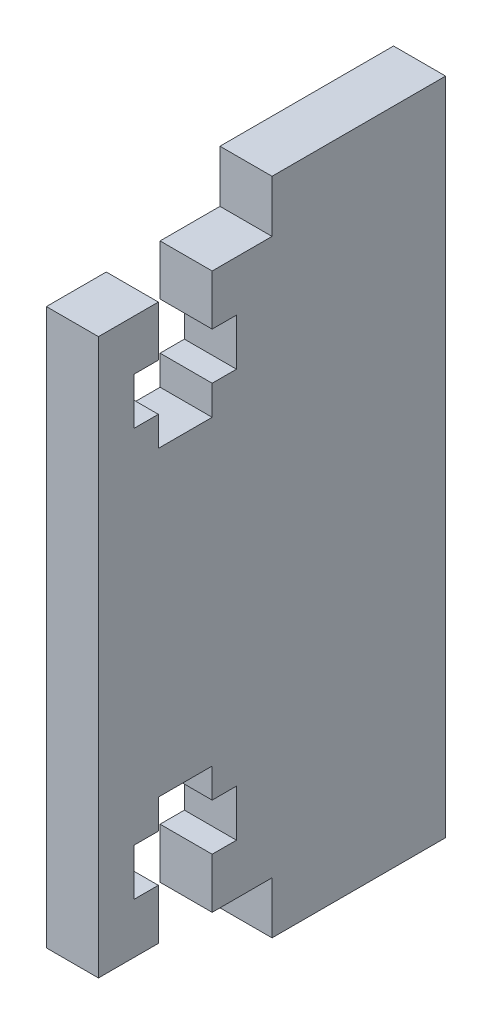
ISO-10303-21;
HEADER;
FILE_DESCRIPTION(('STEP AP214'),'2;1');
FILE_NAME('part.step','',(''),(''),'','','');
FILE_SCHEMA(('AUTOMOTIVE_DESIGN { 1 0 10303 214 1 1 1 1 }'));
ENDSEC;
DATA;
#1=APPLICATION_CONTEXT('core data for automotive mechanical design processes');
#2=APPLICATION_PROTOCOL_DEFINITION('international standard','automotive_design',2000,#1);
#3=PRODUCT_CONTEXT('',#1,'mechanical');
#4=PRODUCT('Part','Part','',(#3));
#5=PRODUCT_RELATED_PRODUCT_CATEGORY('part','',(#4));
#6=PRODUCT_DEFINITION_FORMATION('','',#4);
#7=PRODUCT_DEFINITION_CONTEXT('part definition',#1,'design');
#8=PRODUCT_DEFINITION('design','',#6,#7);
#9=PRODUCT_DEFINITION_SHAPE('','',#8);
#10=(LENGTH_UNIT() NAMED_UNIT(*) SI_UNIT(.MILLI.,.METRE.));
#11=(NAMED_UNIT(*) PLANE_ANGLE_UNIT() SI_UNIT($,.RADIAN.));
#12=(NAMED_UNIT(*) SI_UNIT($,.STERADIAN.) SOLID_ANGLE_UNIT());
#13=UNCERTAINTY_MEASURE_WITH_UNIT(LENGTH_MEASURE(1.E-05),#10,'distance_accuracy_value','');
#14=(GEOMETRIC_REPRESENTATION_CONTEXT(3) GLOBAL_UNCERTAINTY_ASSIGNED_CONTEXT((#13)) GLOBAL_UNIT_ASSIGNED_CONTEXT((#10,
#11,#12)) REPRESENTATION_CONTEXT('',''));
#15=CARTESIAN_POINT('',(0.,0.,0.));
#16=DIRECTION('',(0.,0.,1.));
#17=DIRECTION('',(1.,0.,0.));
#18=AXIS2_PLACEMENT_3D('',#15,#16,#17);
#19=CARTESIAN_POINT('',(0.,3.,0.));
#20=DIRECTION('',(0.,1.,0.));
#21=DIRECTION('',(0.,0.,1.));
#22=AXIS2_PLACEMENT_3D('',#19,#20,#21);
#23=PLANE('',#22);
#24=DIRECTION('',(0.,0.,1.));
#25=VECTOR('',#24,1.);
#26=CARTESIAN_POINT('',(0.,3.,0.));
#27=LINE('',#26,#25);
#28=CARTESIAN_POINT('',(0.,3.,-3.45));
#29=VERTEX_POINT('',#28);
#30=CARTESIAN_POINT('',(0.,3.,0.));
#31=VERTEX_POINT('',#30);
#32=EDGE_CURVE('E453',#29,#31,#27,.T.);
#33=ORIENTED_EDGE('',*,*,#32,.F.);
#34=DIRECTION('',(1.,0.,0.));
#35=VECTOR('',#34,1.);
#36=CARTESIAN_POINT('',(0.,3.,-3.45));
#37=LINE('',#36,#35);
#38=CARTESIAN_POINT('',(3.,3.,-3.45));
#39=VERTEX_POINT('',#38);
#40=EDGE_CURVE('E320',#29,#39,#37,.T.);
#41=ORIENTED_EDGE('',*,*,#40,.T.);
#42=DIRECTION('',(0.,0.,1.));
#43=VECTOR('',#42,1.);
#44=CARTESIAN_POINT('',(3.,3.,0.));
#45=LINE('',#44,#43);
#46=CARTESIAN_POINT('',(3.,3.,0.));
#47=VERTEX_POINT('',#46);
#48=EDGE_CURVE('E459',#39,#47,#45,.T.);
#49=ORIENTED_EDGE('',*,*,#48,.T.);
#50=DIRECTION('',(1.,0.,0.));
#51=VECTOR('',#50,1.);
#52=CARTESIAN_POINT('',(0.,3.,0.));
#53=LINE('',#52,#51);
#54=EDGE_CURVE('E462',#31,#47,#53,.T.);
#55=ORIENTED_EDGE('',*,*,#54,.F.);
#56=EDGE_LOOP('',(#33,#41,#49,#55));
#57=FACE_BOUND('',#56,.T.);
#58=ADVANCED_FACE('F33',(#57),#23,.F.);
#59=CARTESIAN_POINT('',(0.,35.,0.));
#60=DIRECTION('',(0.,-1.,0.));
#61=DIRECTION('',(0.,0.,-1.));
#62=AXIS2_PLACEMENT_3D('',#59,#60,#61);
#63=PLANE('',#62);
#64=DIRECTION('',(0.,0.,-1.));
#65=VECTOR('',#64,1.);
#66=CARTESIAN_POINT('',(0.,35.,0.));
#67=LINE('',#66,#65);
#68=CARTESIAN_POINT('',(0.,35.,-6.55000000000001));
#69=VERTEX_POINT('',#68);
#70=CARTESIAN_POINT('',(0.,35.,-10.));
#71=VERTEX_POINT('',#70);
#72=EDGE_CURVE('E433',#69,#71,#67,.T.);
#73=ORIENTED_EDGE('',*,*,#72,.F.);
#74=DIRECTION('',(1.,0.,0.));
#75=VECTOR('',#74,1.);
#76=CARTESIAN_POINT('',(0.,35.,-6.55000000000001));
#77=LINE('',#76,#75);
#78=CARTESIAN_POINT('',(3.,35.,-6.55000000000001));
#79=VERTEX_POINT('',#78);
#80=EDGE_CURVE('E295',#69,#79,#77,.T.);
#81=ORIENTED_EDGE('',*,*,#80,.T.);
#82=DIRECTION('',(0.,0.,-1.));
#83=VECTOR('',#82,1.);
#84=CARTESIAN_POINT('',(3.,35.,0.));
#85=LINE('',#84,#83);
#86=CARTESIAN_POINT('',(3.,35.,-10.));
#87=VERTEX_POINT('',#86);
#88=EDGE_CURVE('E441',#79,#87,#85,.T.);
#89=ORIENTED_EDGE('',*,*,#88,.T.);
#90=DIRECTION('',(1.,0.,0.));
#91=VECTOR('',#90,1.);
#92=CARTESIAN_POINT('',(0.,35.,-10.));
#93=LINE('',#92,#91);
#94=EDGE_CURVE('E447',#71,#87,#93,.T.);
#95=ORIENTED_EDGE('',*,*,#94,.F.);
#96=EDGE_LOOP('',(#73,#81,#89,#95));
#97=FACE_BOUND('',#96,.T.);
#98=ADVANCED_FACE('F503',(#97),#63,.F.);
#99=CARTESIAN_POINT('',(3.,0.,0.));
#100=DIRECTION('',(0.,0.,-1.));
#101=DIRECTION('',(-1.,0.,0.));
#102=AXIS2_PLACEMENT_3D('',#99,#100,#101);
#103=PLANE('',#102);
#104=DIRECTION('',(0.,-1.,0.));
#105=VECTOR('',#104,1.);
#106=CARTESIAN_POINT('',(3.,0.,0.));
#107=LINE('',#106,#105);
#108=CARTESIAN_POINT('',(3.,35.,0.));
#109=VERTEX_POINT('',#108);
#110=EDGE_CURVE('E468',#109,#47,#107,.T.);
#111=ORIENTED_EDGE('',*,*,#110,.F.);
#112=DIRECTION('',(1.,0.,0.));
#113=VECTOR('',#112,1.);
#114=CARTESIAN_POINT('',(0.,35.,0.));
#115=LINE('',#114,#113);
#116=CARTESIAN_POINT('',(0.,35.,0.));
#117=VERTEX_POINT('',#116);
#118=EDGE_CURVE('E436',#117,#109,#115,.T.);
#119=ORIENTED_EDGE('',*,*,#118,.F.);
#120=DIRECTION('',(0.,-1.,0.));
#121=VECTOR('',#120,1.);
#122=CARTESIAN_POINT('',(0.,0.,0.));
#123=LINE('',#122,#121);
#124=EDGE_CURVE('E446',#117,#31,#123,.T.);
#125=ORIENTED_EDGE('',*,*,#124,.T.);
#126=ORIENTED_EDGE('',*,*,#54,.T.);
#127=EDGE_LOOP('',(#111,#119,#125,#126));
#128=FACE_BOUND('',#127,.T.);
#129=ADVANCED_FACE('F35',(#128),#103,.F.);
#130=CARTESIAN_POINT('',(3.,0.,0.));
#131=DIRECTION('',(0.,1.,0.));
#132=DIRECTION('',(0.,0.,1.));
#133=AXIS2_PLACEMENT_3D('',#130,#131,#132);
#134=PLANE('',#133);
#135=DIRECTION('',(0.,0.,-1.));
#136=VECTOR('',#135,1.);
#137=CARTESIAN_POINT('',(3.,0.,0.));
#138=LINE('',#137,#136);
#139=CARTESIAN_POINT('',(3.,0.,-10.));
#140=VERTEX_POINT('',#139);
#141=CARTESIAN_POINT('',(3.,0.,-20.));
#142=VERTEX_POINT('',#141);
#143=EDGE_CURVE('E471',#140,#142,#138,.T.);
#144=ORIENTED_EDGE('',*,*,#143,.F.);
#145=DIRECTION('',(1.,0.,0.));
#146=VECTOR('',#145,1.);
#147=CARTESIAN_POINT('',(0.,0.,-10.));
#148=LINE('',#147,#146);
#149=CARTESIAN_POINT('',(0.,0.,-10.));
#150=VERTEX_POINT('',#149);
#151=EDGE_CURVE('E456',#150,#140,#148,.T.);
#152=ORIENTED_EDGE('',*,*,#151,.F.);
#153=DIRECTION('',(0.,0.,-1.));
#154=VECTOR('',#153,1.);
#155=CARTESIAN_POINT('',(0.,0.,0.));
#156=LINE('',#155,#154);
#157=CARTESIAN_POINT('',(0.,0.,-20.));
#158=VERTEX_POINT('',#157);
#159=EDGE_CURVE('E481',#150,#158,#156,.T.);
#160=ORIENTED_EDGE('',*,*,#159,.T.);
#161=DIRECTION('',(-1.,0.,0.));
#162=VECTOR('',#161,1.);
#163=CARTESIAN_POINT('',(3.,0.,-20.));
#164=LINE('',#163,#162);
#165=EDGE_CURVE('E11',#142,#158,#164,.T.);
#166=ORIENTED_EDGE('',*,*,#165,.F.);
#167=EDGE_LOOP('',(#144,#152,#160,#166));
#168=FACE_BOUND('',#167,.T.);
#169=ADVANCED_FACE('F515',(#168),#134,.F.);
#170=CARTESIAN_POINT('',(3.,0.,-20.));
#171=DIRECTION('',(0.,0.,1.));
#172=DIRECTION('',(1.,0.,0.));
#173=AXIS2_PLACEMENT_3D('',#170,#171,#172);
#174=PLANE('',#173);
#175=DIRECTION('',(0.,1.,0.));
#176=VECTOR('',#175,1.);
#177=CARTESIAN_POINT('',(0.,0.,-20.));
#178=LINE('',#177,#176);
#179=CARTESIAN_POINT('',(0.,38.,-20.));
#180=VERTEX_POINT('',#179);
#181=EDGE_CURVE('E483',#158,#180,#178,.T.);
#182=ORIENTED_EDGE('',*,*,#181,.T.);
#183=DIRECTION('',(-1.,0.,0.));
#184=VECTOR('',#183,1.);
#185=CARTESIAN_POINT('',(3.,38.,-20.));
#186=LINE('',#185,#184);
#187=CARTESIAN_POINT('',(3.,38.,-20.));
#188=VERTEX_POINT('',#187);
#189=EDGE_CURVE('E41',#188,#180,#186,.T.);
#190=ORIENTED_EDGE('',*,*,#189,.F.);
#191=DIRECTION('',(0.,1.,0.));
#192=VECTOR('',#191,1.);
#193=CARTESIAN_POINT('',(3.,0.,-20.));
#194=LINE('',#193,#192);
#195=EDGE_CURVE('E474',#142,#188,#194,.T.);
#196=ORIENTED_EDGE('',*,*,#195,.F.);
#197=ORIENTED_EDGE('',*,*,#165,.T.);
#198=EDGE_LOOP('',(#182,#190,#196,#197));
#199=FACE_BOUND('',#198,.T.);
#200=ADVANCED_FACE('F513',(#199),#174,.F.);
#201=CARTESIAN_POINT('',(3.,38.,0.));
#202=DIRECTION('',(0.,-1.,0.));
#203=DIRECTION('',(0.,0.,-1.));
#204=AXIS2_PLACEMENT_3D('',#201,#202,#203);
#205=PLANE('',#204);
#206=DIRECTION('',(0.,0.,1.));
#207=VECTOR('',#206,1.);
#208=CARTESIAN_POINT('',(0.,38.,0.));
#209=LINE('',#208,#207);
#210=CARTESIAN_POINT('',(0.,38.,-10.));
#211=VERTEX_POINT('',#210);
#212=EDGE_CURVE('E472',#180,#211,#209,.T.);
#213=ORIENTED_EDGE('',*,*,#212,.T.);
#214=DIRECTION('',(1.,0.,0.));
#215=VECTOR('',#214,1.);
#216=CARTESIAN_POINT('',(0.,38.,-10.));
#217=LINE('',#216,#215);
#218=CARTESIAN_POINT('',(3.,38.,-10.));
#219=VERTEX_POINT('',#218);
#220=EDGE_CURVE('E443',#211,#219,#217,.T.);
#221=ORIENTED_EDGE('',*,*,#220,.T.);
#222=DIRECTION('',(0.,0.,1.));
#223=VECTOR('',#222,1.);
#224=CARTESIAN_POINT('',(3.,38.,0.));
#225=LINE('',#224,#223);
#226=EDGE_CURVE('E476',#188,#219,#225,.T.);
#227=ORIENTED_EDGE('',*,*,#226,.F.);
#228=ORIENTED_EDGE('',*,*,#189,.T.);
#229=EDGE_LOOP('',(#213,#221,#227,#228));
#230=FACE_BOUND('',#229,.T.);
#231=ADVANCED_FACE('F491',(#230),#205,.F.);
#232=CARTESIAN_POINT('',(3.,0.,0.));
#233=DIRECTION('',(-1.,0.,0.));
#234=DIRECTION('',(0.,0.,1.));
#235=AXIS2_PLACEMENT_3D('',#232,#233,#234);
#236=PLANE('',#235);
#237=ORIENTED_EDGE('',*,*,#48,.F.);
#238=DIRECTION('',(0.,-1.,0.));
#239=VECTOR('',#238,1.);
#240=CARTESIAN_POINT('',(3.,3.,-3.45));
#241=LINE('',#240,#239);
#242=CARTESIAN_POINT('',(3.,5.9,-3.45));
#243=VERTEX_POINT('',#242);
#244=EDGE_CURVE('E264',#243,#39,#241,.T.);
#245=ORIENTED_EDGE('',*,*,#244,.F.);
#246=DIRECTION('',(0.,0.,-1.));
#247=VECTOR('',#246,1.);
#248=CARTESIAN_POINT('',(3.,5.9,-3.45));
#249=LINE('',#248,#247);
#250=CARTESIAN_POINT('',(3.,5.9,-2.05));
#251=VERTEX_POINT('',#250);
#252=EDGE_CURVE('E266',#251,#243,#249,.T.);
#253=ORIENTED_EDGE('',*,*,#252,.F.);
#254=DIRECTION('',(0.,-1.,0.));
#255=VECTOR('',#254,1.);
#256=CARTESIAN_POINT('',(3.,5.9,-2.05));
#257=LINE('',#256,#255);
#258=CARTESIAN_POINT('',(3.,8.6,-2.05));
#259=VERTEX_POINT('',#258);
#260=EDGE_CURVE('E315',#259,#251,#257,.T.);
#261=ORIENTED_EDGE('',*,*,#260,.F.);
#262=DIRECTION('',(0.,0.,1.));
#263=VECTOR('',#262,1.);
#264=CARTESIAN_POINT('',(3.,8.6,-2.05));
#265=LINE('',#264,#263);
#266=CARTESIAN_POINT('',(3.,8.6,-3.45));
#267=VERTEX_POINT('',#266);
#268=EDGE_CURVE('E312',#267,#259,#265,.T.);
#269=ORIENTED_EDGE('',*,*,#268,.F.);
#270=DIRECTION('',(0.,-1.,0.));
#271=VECTOR('',#270,1.);
#272=CARTESIAN_POINT('',(3.,8.6,-3.45));
#273=LINE('',#272,#271);
#274=CARTESIAN_POINT('',(3.,10.3,-3.45));
#275=VERTEX_POINT('',#274);
#276=EDGE_CURVE('E309',#275,#267,#273,.T.);
#277=ORIENTED_EDGE('',*,*,#276,.F.);
#278=DIRECTION('',(0.,0.,1.));
#279=VECTOR('',#278,1.);
#280=CARTESIAN_POINT('',(3.,10.3,-3.45));
#281=LINE('',#280,#279);
#282=CARTESIAN_POINT('',(3.,10.3,-6.55));
#283=VERTEX_POINT('',#282);
#284=EDGE_CURVE('E306',#283,#275,#281,.T.);
#285=ORIENTED_EDGE('',*,*,#284,.F.);
#286=DIRECTION('',(0.,1.,0.));
#287=VECTOR('',#286,1.);
#288=CARTESIAN_POINT('',(3.,10.3,-6.55));
#289=LINE('',#288,#287);
#290=CARTESIAN_POINT('',(3.,8.6,-6.55));
#291=VERTEX_POINT('',#290);
#292=EDGE_CURVE('E303',#291,#283,#289,.T.);
#293=ORIENTED_EDGE('',*,*,#292,.F.);
#294=DIRECTION('',(0.,0.,1.));
#295=VECTOR('',#294,1.);
#296=CARTESIAN_POINT('',(3.,8.6,-6.55));
#297=LINE('',#296,#295);
#298=CARTESIAN_POINT('',(3.,8.6,-7.95));
#299=VERTEX_POINT('',#298);
#300=EDGE_CURVE('E300',#299,#291,#297,.T.);
#301=ORIENTED_EDGE('',*,*,#300,.F.);
#302=DIRECTION('',(0.,1.,0.));
#303=VECTOR('',#302,1.);
#304=CARTESIAN_POINT('',(3.,8.6,-7.95));
#305=LINE('',#304,#303);
#306=CARTESIAN_POINT('',(3.,5.9,-7.95));
#307=VERTEX_POINT('',#306);
#308=EDGE_CURVE('E297',#307,#299,#305,.T.);
#309=ORIENTED_EDGE('',*,*,#308,.F.);
#310=DIRECTION('',(0.,0.,-1.));
#311=VECTOR('',#310,1.);
#312=CARTESIAN_POINT('',(3.,5.9,-7.95));
#313=LINE('',#312,#311);
#314=CARTESIAN_POINT('',(3.,5.9,-6.55));
#315=VERTEX_POINT('',#314);
#316=EDGE_CURVE('E294',#315,#307,#313,.T.);
#317=ORIENTED_EDGE('',*,*,#316,.F.);
#318=DIRECTION('',(0.,1.,0.));
#319=VECTOR('',#318,1.);
#320=CARTESIAN_POINT('',(3.,5.9,-6.55));
#321=LINE('',#320,#319);
#322=CARTESIAN_POINT('',(3.,3.,-6.55));
#323=VERTEX_POINT('',#322);
#324=EDGE_CURVE('E244',#323,#315,#321,.T.);
#325=ORIENTED_EDGE('',*,*,#324,.F.);
#326=CARTESIAN_POINT('',(3.,3.,-10.));
#327=VERTEX_POINT('',#326);
#328=EDGE_CURVE('E454',#327,#323,#45,.T.);
#329=ORIENTED_EDGE('',*,*,#328,.F.);
#330=DIRECTION('',(0.,1.,0.));
#331=VECTOR('',#330,1.);
#332=CARTESIAN_POINT('',(3.,0.,-10.));
#333=LINE('',#332,#331);
#334=EDGE_CURVE('E323',#140,#327,#333,.T.);
#335=ORIENTED_EDGE('',*,*,#334,.F.);
#336=ORIENTED_EDGE('',*,*,#143,.T.);
#337=ORIENTED_EDGE('',*,*,#195,.T.);
#338=ORIENTED_EDGE('',*,*,#226,.T.);
#339=DIRECTION('',(0.,1.,0.));
#340=VECTOR('',#339,1.);
#341=CARTESIAN_POINT('',(3.,38.,-10.));
#342=LINE('',#341,#340);
#343=EDGE_CURVE('E440',#87,#219,#342,.T.);
#344=ORIENTED_EDGE('',*,*,#343,.F.);
#345=ORIENTED_EDGE('',*,*,#88,.F.);
#346=DIRECTION('',(0.,1.,0.));
#347=VECTOR('',#346,1.);
#348=CARTESIAN_POINT('',(3.,35.,-6.55000000000001));
#349=LINE('',#348,#347);
#350=CARTESIAN_POINT('',(3.,32.1,-6.55000000000001));
#351=VERTEX_POINT('',#350);
#352=EDGE_CURVE('E344',#351,#79,#349,.T.);
#353=ORIENTED_EDGE('',*,*,#352,.F.);
#354=DIRECTION('',(0.,0.,1.));
#355=VECTOR('',#354,1.);
#356=CARTESIAN_POINT('',(3.,32.1,-6.55000000000001));
#357=LINE('',#356,#355);
#358=CARTESIAN_POINT('',(3.,32.1,-7.95000000000001));
#359=VERTEX_POINT('',#358);
#360=EDGE_CURVE('E402',#359,#351,#357,.T.);
#361=ORIENTED_EDGE('',*,*,#360,.F.);
#362=DIRECTION('',(0.,1.,0.));
#363=VECTOR('',#362,1.);
#364=CARTESIAN_POINT('',(3.,32.1,-7.95000000000001));
#365=LINE('',#364,#363);
#366=CARTESIAN_POINT('',(3.,29.4,-7.95000000000004));
#367=VERTEX_POINT('',#366);
#368=EDGE_CURVE('E399',#367,#359,#365,.T.);
#369=ORIENTED_EDGE('',*,*,#368,.F.);
#370=DIRECTION('',(0.,0.,-1.));
#371=VECTOR('',#370,1.);
#372=CARTESIAN_POINT('',(3.,29.4,-7.95000000000004));
#373=LINE('',#372,#371);
#374=CARTESIAN_POINT('',(3.,29.4,-6.55000000000005));
#375=VERTEX_POINT('',#374);
#376=EDGE_CURVE('E396',#375,#367,#373,.T.);
#377=ORIENTED_EDGE('',*,*,#376,.F.);
#378=DIRECTION('',(0.,1.,0.));
#379=VECTOR('',#378,1.);
#380=CARTESIAN_POINT('',(3.,29.4,-6.55000000000005));
#381=LINE('',#380,#379);
#382=CARTESIAN_POINT('',(3.,27.7,-6.55000000000005));
#383=VERTEX_POINT('',#382);
#384=EDGE_CURVE('E393',#383,#375,#381,.T.);
#385=ORIENTED_EDGE('',*,*,#384,.F.);
#386=DIRECTION('',(0.,0.,-1.));
#387=VECTOR('',#386,1.);
#388=CARTESIAN_POINT('',(3.,27.7,-6.55000000000005));
#389=LINE('',#388,#387);
#390=CARTESIAN_POINT('',(3.,27.7,-3.45000000000005));
#391=VERTEX_POINT('',#390);
#392=EDGE_CURVE('E390',#391,#383,#389,.T.);
#393=ORIENTED_EDGE('',*,*,#392,.F.);
#394=DIRECTION('',(0.,-1.,0.));
#395=VECTOR('',#394,1.);
#396=CARTESIAN_POINT('',(3.,27.7,-3.45000000000005));
#397=LINE('',#396,#395);
#398=CARTESIAN_POINT('',(3.,29.4,-3.45000000000005));
#399=VERTEX_POINT('',#398);
#400=EDGE_CURVE('E387',#399,#391,#397,.T.);
#401=ORIENTED_EDGE('',*,*,#400,.F.);
#402=DIRECTION('',(0.,0.,-1.));
#403=VECTOR('',#402,1.);
#404=CARTESIAN_POINT('',(3.,29.4,-3.45000000000005));
#405=LINE('',#404,#403);
#406=CARTESIAN_POINT('',(3.,29.4,-2.05000000000005));
#407=VERTEX_POINT('',#406);
#408=EDGE_CURVE('E384',#407,#399,#405,.T.);
#409=ORIENTED_EDGE('',*,*,#408,.F.);
#410=DIRECTION('',(0.,-1.,0.));
#411=VECTOR('',#410,1.);
#412=CARTESIAN_POINT('',(3.,29.4,-2.05000000000005));
#413=LINE('',#412,#411);
#414=CARTESIAN_POINT('',(3.,32.1,-2.05000000000001));
#415=VERTEX_POINT('',#414);
#416=EDGE_CURVE('E381',#415,#407,#413,.T.);
#417=ORIENTED_EDGE('',*,*,#416,.F.);
#418=DIRECTION('',(0.,0.,1.));
#419=VECTOR('',#418,1.);
#420=CARTESIAN_POINT('',(3.,32.1,-2.05000000000001));
#421=LINE('',#420,#419);
#422=CARTESIAN_POINT('',(3.,32.1,-3.45000000000001));
#423=VERTEX_POINT('',#422);
#424=EDGE_CURVE('E378',#423,#415,#421,.T.);
#425=ORIENTED_EDGE('',*,*,#424,.F.);
#426=DIRECTION('',(0.,-1.,0.));
#427=VECTOR('',#426,1.);
#428=CARTESIAN_POINT('',(3.,32.1,-3.45000000000001));
#429=LINE('',#428,#427);
#430=CARTESIAN_POINT('',(3.,35.,-3.45000000000001));
#431=VERTEX_POINT('',#430);
#432=EDGE_CURVE('E375',#431,#423,#429,.T.);
#433=ORIENTED_EDGE('',*,*,#432,.F.);
#434=EDGE_CURVE('E437',#109,#431,#85,.T.);
#435=ORIENTED_EDGE('',*,*,#434,.F.);
#436=ORIENTED_EDGE('',*,*,#110,.T.);
#437=EDGE_LOOP('',(#237,#245,#253,#261,#269,#277,#285,#293,#301,#309,#317,#325,#329,#335,#336,
#337,#338,#344,#345,#353,#361,#369,#377,#385,#393,#401,#409,#417,#425,#433,#435,#436));
#438=FACE_BOUND('',#437,.T.);
#439=ADVANCED_FACE('F508',(#438),#236,.F.);
#440=CARTESIAN_POINT('',(0.,0.,0.));
#441=DIRECTION('',(-1.,0.,0.));
#442=DIRECTION('',(0.,0.,1.));
#443=AXIS2_PLACEMENT_3D('',#440,#441,#442);
#444=PLANE('',#443);
#445=DIRECTION('',(0.,-1.,0.));
#446=VECTOR('',#445,1.);
#447=CARTESIAN_POINT('',(0.,3.,-3.45));
#448=LINE('',#447,#446);
#449=CARTESIAN_POINT('',(0.,5.9,-3.45));
#450=VERTEX_POINT('',#449);
#451=EDGE_CURVE('E291',#450,#29,#448,.T.);
#452=ORIENTED_EDGE('',*,*,#451,.T.);
#453=ORIENTED_EDGE('',*,*,#32,.T.);
#454=ORIENTED_EDGE('',*,*,#124,.F.);
#455=CARTESIAN_POINT('',(0.,35.,-3.45000000000001));
#456=VERTEX_POINT('',#455);
#457=EDGE_CURVE('E429',#117,#456,#67,.T.);
#458=ORIENTED_EDGE('',*,*,#457,.T.);
#459=DIRECTION('',(0.,-1.,0.));
#460=VECTOR('',#459,1.);
#461=CARTESIAN_POINT('',(0.,32.1,-3.45000000000001));
#462=LINE('',#461,#460);
#463=CARTESIAN_POINT('',(0.,32.1,-3.45000000000001));
#464=VERTEX_POINT('',#463);
#465=EDGE_CURVE('E56',#456,#464,#462,.T.);
#466=ORIENTED_EDGE('',*,*,#465,.T.);
#467=DIRECTION('',(0.,0.,1.));
#468=VECTOR('',#467,1.);
#469=CARTESIAN_POINT('',(0.,32.1,-2.05000000000001));
#470=LINE('',#469,#468);
#471=CARTESIAN_POINT('',(0.,32.1,-2.05000000000001));
#472=VERTEX_POINT('',#471);
#473=EDGE_CURVE('E343',#464,#472,#470,.T.);
#474=ORIENTED_EDGE('',*,*,#473,.T.);
#475=DIRECTION('',(0.,-1.,0.));
#476=VECTOR('',#475,1.);
#477=CARTESIAN_POINT('',(0.,29.4,-2.05000000000005));
#478=LINE('',#477,#476);
#479=CARTESIAN_POINT('',(0.,29.4,-2.05000000000005));
#480=VERTEX_POINT('',#479);
#481=EDGE_CURVE('E347',#472,#480,#478,.T.);
#482=ORIENTED_EDGE('',*,*,#481,.T.);
#483=DIRECTION('',(0.,0.,-1.));
#484=VECTOR('',#483,1.);
#485=CARTESIAN_POINT('',(0.,29.4,-3.45000000000005));
#486=LINE('',#485,#484);
#487=CARTESIAN_POINT('',(0.,29.4,-3.45000000000005));
#488=VERTEX_POINT('',#487);
#489=EDGE_CURVE('E350',#480,#488,#486,.T.);
#490=ORIENTED_EDGE('',*,*,#489,.T.);
#491=DIRECTION('',(0.,-1.,0.));
#492=VECTOR('',#491,1.);
#493=CARTESIAN_POINT('',(0.,27.7,-3.45000000000005));
#494=LINE('',#493,#492);
#495=CARTESIAN_POINT('',(0.,27.7,-3.45000000000005));
#496=VERTEX_POINT('',#495);
#497=EDGE_CURVE('E353',#488,#496,#494,.T.);
#498=ORIENTED_EDGE('',*,*,#497,.T.);
#499=DIRECTION('',(0.,0.,-1.));
#500=VECTOR('',#499,1.);
#501=CARTESIAN_POINT('',(0.,27.7,-6.55000000000005));
#502=LINE('',#501,#500);
#503=CARTESIAN_POINT('',(0.,27.7,-6.55000000000005));
#504=VERTEX_POINT('',#503);
#505=EDGE_CURVE('E356',#496,#504,#502,.T.);
#506=ORIENTED_EDGE('',*,*,#505,.T.);
#507=DIRECTION('',(0.,1.,0.));
#508=VECTOR('',#507,1.);
#509=CARTESIAN_POINT('',(0.,29.4,-6.55000000000005));
#510=LINE('',#509,#508);
#511=CARTESIAN_POINT('',(0.,29.4,-6.55000000000005));
#512=VERTEX_POINT('',#511);
#513=EDGE_CURVE('E359',#504,#512,#510,.T.);
#514=ORIENTED_EDGE('',*,*,#513,.T.);
#515=DIRECTION('',(0.,0.,-1.));
#516=VECTOR('',#515,1.);
#517=CARTESIAN_POINT('',(0.,29.4,-7.95000000000004));
#518=LINE('',#517,#516);
#519=CARTESIAN_POINT('',(0.,29.4,-7.95000000000004));
#520=VERTEX_POINT('',#519);
#521=EDGE_CURVE('E362',#512,#520,#518,.T.);
#522=ORIENTED_EDGE('',*,*,#521,.T.);
#523=DIRECTION('',(0.,1.,0.));
#524=VECTOR('',#523,1.);
#525=CARTESIAN_POINT('',(0.,32.1,-7.95000000000001));
#526=LINE('',#525,#524);
#527=CARTESIAN_POINT('',(0.,32.1,-7.95000000000001));
#528=VERTEX_POINT('',#527);
#529=EDGE_CURVE('E365',#520,#528,#526,.T.);
#530=ORIENTED_EDGE('',*,*,#529,.T.);
#531=DIRECTION('',(0.,0.,1.));
#532=VECTOR('',#531,1.);
#533=CARTESIAN_POINT('',(0.,32.1,-6.55000000000001));
#534=LINE('',#533,#532);
#535=CARTESIAN_POINT('',(0.,32.1,-6.55000000000001));
#536=VERTEX_POINT('',#535);
#537=EDGE_CURVE('E368',#528,#536,#534,.T.);
#538=ORIENTED_EDGE('',*,*,#537,.T.);
#539=DIRECTION('',(0.,1.,0.));
#540=VECTOR('',#539,1.);
#541=CARTESIAN_POINT('',(0.,35.,-6.55000000000001));
#542=LINE('',#541,#540);
#543=EDGE_CURVE('E371',#536,#69,#542,.T.);
#544=ORIENTED_EDGE('',*,*,#543,.T.);
#545=ORIENTED_EDGE('',*,*,#72,.T.);
#546=DIRECTION('',(0.,1.,0.));
#547=VECTOR('',#546,1.);
#548=CARTESIAN_POINT('',(0.,38.,-10.));
#549=LINE('',#548,#547);
#550=EDGE_CURVE('E432',#71,#211,#549,.T.);
#551=ORIENTED_EDGE('',*,*,#550,.T.);
#552=ORIENTED_EDGE('',*,*,#212,.F.);
#553=ORIENTED_EDGE('',*,*,#181,.F.);
#554=ORIENTED_EDGE('',*,*,#159,.F.);
#555=DIRECTION('',(0.,1.,0.));
#556=VECTOR('',#555,1.);
#557=CARTESIAN_POINT('',(0.,0.,-10.));
#558=LINE('',#557,#556);
#559=CARTESIAN_POINT('',(0.,3.,-10.));
#560=VERTEX_POINT('',#559);
#561=EDGE_CURVE('E451',#150,#560,#558,.T.);
#562=ORIENTED_EDGE('',*,*,#561,.T.);
#563=CARTESIAN_POINT('',(0.,3.,-6.55));
#564=VERTEX_POINT('',#563);
#565=EDGE_CURVE('E263',#560,#564,#27,.T.);
#566=ORIENTED_EDGE('',*,*,#565,.T.);
#567=DIRECTION('',(0.,1.,0.));
#568=VECTOR('',#567,1.);
#569=CARTESIAN_POINT('',(0.,5.9,-6.55));
#570=LINE('',#569,#568);
#571=CARTESIAN_POINT('',(0.,5.9,-6.55));
#572=VERTEX_POINT('',#571);
#573=EDGE_CURVE('E48',#564,#572,#570,.T.);
#574=ORIENTED_EDGE('',*,*,#573,.T.);
#575=DIRECTION('',(0.,0.,-1.));
#576=VECTOR('',#575,1.);
#577=CARTESIAN_POINT('',(0.,5.9,-7.95));
#578=LINE('',#577,#576);
#579=CARTESIAN_POINT('',(0.,5.9,-7.95));
#580=VERTEX_POINT('',#579);
#581=EDGE_CURVE('E252',#572,#580,#578,.T.);
#582=ORIENTED_EDGE('',*,*,#581,.T.);
#583=DIRECTION('',(0.,1.,0.));
#584=VECTOR('',#583,1.);
#585=CARTESIAN_POINT('',(0.,8.6,-7.95));
#586=LINE('',#585,#584);
#587=CARTESIAN_POINT('',(0.,8.6,-7.95));
#588=VERTEX_POINT('',#587);
#589=EDGE_CURVE('E257',#580,#588,#586,.T.);
#590=ORIENTED_EDGE('',*,*,#589,.T.);
#591=DIRECTION('',(0.,0.,1.));
#592=VECTOR('',#591,1.);
#593=CARTESIAN_POINT('',(0.,8.6,-6.55));
#594=LINE('',#593,#592);
#595=CARTESIAN_POINT('',(0.,8.6,-6.55));
#596=VERTEX_POINT('',#595);
#597=EDGE_CURVE('E270',#588,#596,#594,.T.);
#598=ORIENTED_EDGE('',*,*,#597,.T.);
#599=DIRECTION('',(0.,1.,0.));
#600=VECTOR('',#599,1.);
#601=CARTESIAN_POINT('',(0.,10.3,-6.55));
#602=LINE('',#601,#600);
#603=CARTESIAN_POINT('',(0.,10.3,-6.55));
#604=VERTEX_POINT('',#603);
#605=EDGE_CURVE('E273',#596,#604,#602,.T.);
#606=ORIENTED_EDGE('',*,*,#605,.T.);
#607=DIRECTION('',(0.,0.,1.));
#608=VECTOR('',#607,1.);
#609=CARTESIAN_POINT('',(0.,10.3,-3.45));
#610=LINE('',#609,#608);
#611=CARTESIAN_POINT('',(0.,10.3,-3.45));
#612=VERTEX_POINT('',#611);
#613=EDGE_CURVE('E276',#604,#612,#610,.T.);
#614=ORIENTED_EDGE('',*,*,#613,.T.);
#615=DIRECTION('',(0.,-1.,0.));
#616=VECTOR('',#615,1.);
#617=CARTESIAN_POINT('',(0.,8.6,-3.45));
#618=LINE('',#617,#616);
#619=CARTESIAN_POINT('',(0.,8.6,-3.45));
#620=VERTEX_POINT('',#619);
#621=EDGE_CURVE('E279',#612,#620,#618,.T.);
#622=ORIENTED_EDGE('',*,*,#621,.T.);
#623=DIRECTION('',(0.,0.,1.));
#624=VECTOR('',#623,1.);
#625=CARTESIAN_POINT('',(0.,8.6,-2.05));
#626=LINE('',#625,#624);
#627=CARTESIAN_POINT('',(0.,8.6,-2.05));
#628=VERTEX_POINT('',#627);
#629=EDGE_CURVE('E282',#620,#628,#626,.T.);
#630=ORIENTED_EDGE('',*,*,#629,.T.);
#631=DIRECTION('',(0.,-1.,0.));
#632=VECTOR('',#631,1.);
#633=CARTESIAN_POINT('',(0.,5.9,-2.05));
#634=LINE('',#633,#632);
#635=CARTESIAN_POINT('',(0.,5.9,-2.05));
#636=VERTEX_POINT('',#635);
#637=EDGE_CURVE('E285',#628,#636,#634,.T.);
#638=ORIENTED_EDGE('',*,*,#637,.T.);
#639=DIRECTION('',(0.,0.,-1.));
#640=VECTOR('',#639,1.);
#641=CARTESIAN_POINT('',(0.,5.9,-3.45));
#642=LINE('',#641,#640);
#643=EDGE_CURVE('E288',#636,#450,#642,.T.);
#644=ORIENTED_EDGE('',*,*,#643,.T.);
#645=EDGE_LOOP('',(#452,#453,#454,#458,#466,#474,#482,#490,#498,#506,#514,#522,#530,#538,#544,
#545,#551,#552,#553,#554,#562,#566,#574,#582,#590,#598,#606,#614,#622,#630,#638,#644));
#646=FACE_BOUND('',#645,.T.);
#647=ADVANCED_FACE('F261',(#646),#444,.T.);
#648=ORIENTED_EDGE('',*,*,#328,.T.);
#649=DIRECTION('',(1.,0.,0.));
#650=VECTOR('',#649,1.);
#651=CARTESIAN_POINT('',(0.,3.,-6.55));
#652=LINE('',#651,#650);
#653=EDGE_CURVE('E249',#564,#323,#652,.T.);
#654=ORIENTED_EDGE('',*,*,#653,.F.);
#655=ORIENTED_EDGE('',*,*,#565,.F.);
#656=DIRECTION('',(1.,0.,0.));
#657=VECTOR('',#656,1.);
#658=CARTESIAN_POINT('',(0.,3.,-10.));
#659=LINE('',#658,#657);
#660=EDGE_CURVE('E465',#560,#327,#659,.T.);
#661=ORIENTED_EDGE('',*,*,#660,.T.);
#662=EDGE_LOOP('',(#648,#654,#655,#661));
#663=FACE_BOUND('',#662,.T.);
#664=ADVANCED_FACE('F522',(#663),#23,.F.);
#665=CARTESIAN_POINT('',(0.,0.,-10.));
#666=DIRECTION('',(0.,0.,-1.));
#667=DIRECTION('',(-1.,0.,0.));
#668=AXIS2_PLACEMENT_3D('',#665,#666,#667);
#669=PLANE('',#668);
#670=ORIENTED_EDGE('',*,*,#334,.T.);
#671=ORIENTED_EDGE('',*,*,#660,.F.);
#672=ORIENTED_EDGE('',*,*,#561,.F.);
#673=ORIENTED_EDGE('',*,*,#151,.T.);
#674=EDGE_LOOP('',(#670,#671,#672,#673));
#675=FACE_BOUND('',#674,.T.);
#676=ADVANCED_FACE('F519',(#675),#669,.F.);
#677=CARTESIAN_POINT('',(0.,38.,-10.));
#678=DIRECTION('',(0.,0.,-1.));
#679=DIRECTION('',(0.,1.,0.));
#680=AXIS2_PLACEMENT_3D('',#677,#678,#679);
#681=PLANE('',#680);
#682=ORIENTED_EDGE('',*,*,#343,.T.);
#683=ORIENTED_EDGE('',*,*,#220,.F.);
#684=ORIENTED_EDGE('',*,*,#550,.F.);
#685=ORIENTED_EDGE('',*,*,#94,.T.);
#686=EDGE_LOOP('',(#682,#683,#684,#685));
#687=FACE_BOUND('',#686,.T.);
#688=ADVANCED_FACE('F500',(#687),#681,.F.);
#689=ORIENTED_EDGE('',*,*,#434,.T.);
#690=DIRECTION('',(1.,0.,0.));
#691=VECTOR('',#690,1.);
#692=CARTESIAN_POINT('',(0.,35.,-3.45000000000001));
#693=LINE('',#692,#691);
#694=EDGE_CURVE('E374',#456,#431,#693,.T.);
#695=ORIENTED_EDGE('',*,*,#694,.F.);
#696=ORIENTED_EDGE('',*,*,#457,.F.);
#697=ORIENTED_EDGE('',*,*,#118,.T.);
#698=EDGE_LOOP('',(#689,#695,#696,#697));
#699=FACE_BOUND('',#698,.T.);
#700=ADVANCED_FACE('F568',(#699),#63,.F.);
#701=CARTESIAN_POINT('',(0.,35.,-6.55000000000001));
#702=DIRECTION('',(0.,0.,-1.));
#703=DIRECTION('',(-1.,0.,0.));
#704=AXIS2_PLACEMENT_3D('',#701,#702,#703);
#705=PLANE('',#704);
#706=ORIENTED_EDGE('',*,*,#352,.T.);
#707=ORIENTED_EDGE('',*,*,#80,.F.);
#708=ORIENTED_EDGE('',*,*,#543,.F.);
#709=DIRECTION('',(1.,0.,0.));
#710=VECTOR('',#709,1.);
#711=CARTESIAN_POINT('',(0.,32.1,-6.55000000000001));
#712=LINE('',#711,#710);
#713=EDGE_CURVE('E408',#536,#351,#712,.T.);
#714=ORIENTED_EDGE('',*,*,#713,.T.);
#715=EDGE_LOOP('',(#706,#707,#708,#714));
#716=FACE_BOUND('',#715,.T.);
#717=ADVANCED_FACE('F607',(#716),#705,.F.);
#718=CARTESIAN_POINT('',(0.,32.1,-6.55000000000001));
#719=DIRECTION('',(0.,1.,0.));
#720=DIRECTION('',(0.,0.,1.));
#721=AXIS2_PLACEMENT_3D('',#718,#719,#720);
#722=PLANE('',#721);
#723=ORIENTED_EDGE('',*,*,#360,.T.);
#724=ORIENTED_EDGE('',*,*,#713,.F.);
#725=ORIENTED_EDGE('',*,*,#537,.F.);
#726=DIRECTION('',(1.,0.,0.));
#727=VECTOR('',#726,1.);
#728=CARTESIAN_POINT('',(0.,32.1,-7.95000000000001));
#729=LINE('',#728,#727);
#730=EDGE_CURVE('E410',#528,#359,#729,.T.);
#731=ORIENTED_EDGE('',*,*,#730,.T.);
#732=EDGE_LOOP('',(#723,#724,#725,#731));
#733=FACE_BOUND('',#732,.T.);
#734=ADVANCED_FACE('F604',(#733),#722,.F.);
#735=CARTESIAN_POINT('',(0.,32.1,-7.95000000000001));
#736=DIRECTION('',(0.,0.,-1.));
#737=DIRECTION('',(0.,1.,0.));
#738=AXIS2_PLACEMENT_3D('',#735,#736,#737);
#739=PLANE('',#738);
#740=ORIENTED_EDGE('',*,*,#368,.T.);
#741=ORIENTED_EDGE('',*,*,#730,.F.);
#742=ORIENTED_EDGE('',*,*,#529,.F.);
#743=DIRECTION('',(1.,0.,0.));
#744=VECTOR('',#743,1.);
#745=CARTESIAN_POINT('',(0.,29.4,-7.95000000000004));
#746=LINE('',#745,#744);
#747=EDGE_CURVE('E412',#520,#367,#746,.T.);
#748=ORIENTED_EDGE('',*,*,#747,.T.);
#749=EDGE_LOOP('',(#740,#741,#742,#748));
#750=FACE_BOUND('',#749,.T.);
#751=ADVANCED_FACE('F601',(#750),#739,.F.);
#752=CARTESIAN_POINT('',(0.,29.4,-7.95000000000004));
#753=DIRECTION('',(0.,-1.,0.));
#754=DIRECTION('',(0.,0.,-1.));
#755=AXIS2_PLACEMENT_3D('',#752,#753,#754);
#756=PLANE('',#755);
#757=ORIENTED_EDGE('',*,*,#376,.T.);
#758=ORIENTED_EDGE('',*,*,#747,.F.);
#759=ORIENTED_EDGE('',*,*,#521,.F.);
#760=DIRECTION('',(1.,0.,0.));
#761=VECTOR('',#760,1.);
#762=CARTESIAN_POINT('',(0.,29.4,-6.55000000000005));
#763=LINE('',#762,#761);
#764=EDGE_CURVE('E414',#512,#375,#763,.T.);
#765=ORIENTED_EDGE('',*,*,#764,.T.);
#766=EDGE_LOOP('',(#757,#758,#759,#765));
#767=FACE_BOUND('',#766,.T.);
#768=ADVANCED_FACE('F597',(#767),#756,.F.);
#769=CARTESIAN_POINT('',(0.,29.4,-6.55000000000005));
#770=DIRECTION('',(0.,0.,-1.));
#771=DIRECTION('',(-1.,0.,0.));
#772=AXIS2_PLACEMENT_3D('',#769,#770,#771);
#773=PLANE('',#772);
#774=ORIENTED_EDGE('',*,*,#384,.T.);
#775=ORIENTED_EDGE('',*,*,#764,.F.);
#776=ORIENTED_EDGE('',*,*,#513,.F.);
#777=DIRECTION('',(1.,0.,0.));
#778=VECTOR('',#777,1.);
#779=CARTESIAN_POINT('',(0.,27.7,-6.55000000000005));
#780=LINE('',#779,#778);
#781=EDGE_CURVE('E416',#504,#383,#780,.T.);
#782=ORIENTED_EDGE('',*,*,#781,.T.);
#783=EDGE_LOOP('',(#774,#775,#776,#782));
#784=FACE_BOUND('',#783,.T.);
#785=ADVANCED_FACE('F593',(#784),#773,.F.);
#786=CARTESIAN_POINT('',(0.,27.7,-6.55000000000005));
#787=DIRECTION('',(0.,-1.,0.));
#788=DIRECTION('',(0.,0.,-1.));
#789=AXIS2_PLACEMENT_3D('',#786,#787,#788);
#790=PLANE('',#789);
#791=ORIENTED_EDGE('',*,*,#392,.T.);
#792=ORIENTED_EDGE('',*,*,#781,.F.);
#793=ORIENTED_EDGE('',*,*,#505,.F.);
#794=DIRECTION('',(1.,0.,0.));
#795=VECTOR('',#794,1.);
#796=CARTESIAN_POINT('',(0.,27.7,-3.45000000000005));
#797=LINE('',#796,#795);
#798=EDGE_CURVE('E418',#496,#391,#797,.T.);
#799=ORIENTED_EDGE('',*,*,#798,.T.);
#800=EDGE_LOOP('',(#791,#792,#793,#799));
#801=FACE_BOUND('',#800,.T.);
#802=ADVANCED_FACE('F589',(#801),#790,.F.);
#803=CARTESIAN_POINT('',(0.,27.7,-3.45000000000005));
#804=DIRECTION('',(0.,0.,1.));
#805=DIRECTION('',(1.,0.,0.));
#806=AXIS2_PLACEMENT_3D('',#803,#804,#805);
#807=PLANE('',#806);
#808=ORIENTED_EDGE('',*,*,#400,.T.);
#809=ORIENTED_EDGE('',*,*,#798,.F.);
#810=ORIENTED_EDGE('',*,*,#497,.F.);
#811=DIRECTION('',(1.,0.,0.));
#812=VECTOR('',#811,1.);
#813=CARTESIAN_POINT('',(0.,29.4,-3.45000000000005));
#814=LINE('',#813,#812);
#815=EDGE_CURVE('E420',#488,#399,#814,.T.);
#816=ORIENTED_EDGE('',*,*,#815,.T.);
#817=EDGE_LOOP('',(#808,#809,#810,#816));
#818=FACE_BOUND('',#817,.T.);
#819=ADVANCED_FACE('F585',(#818),#807,.F.);
#820=CARTESIAN_POINT('',(0.,29.4,-3.45000000000005));
#821=DIRECTION('',(0.,-1.,0.));
#822=DIRECTION('',(0.,0.,-1.));
#823=AXIS2_PLACEMENT_3D('',#820,#821,#822);
#824=PLANE('',#823);
#825=ORIENTED_EDGE('',*,*,#408,.T.);
#826=ORIENTED_EDGE('',*,*,#815,.F.);
#827=ORIENTED_EDGE('',*,*,#489,.F.);
#828=DIRECTION('',(1.,0.,0.));
#829=VECTOR('',#828,1.);
#830=CARTESIAN_POINT('',(0.,29.4,-2.05000000000005));
#831=LINE('',#830,#829);
#832=EDGE_CURVE('E422',#480,#407,#831,.T.);
#833=ORIENTED_EDGE('',*,*,#832,.T.);
#834=EDGE_LOOP('',(#825,#826,#827,#833));
#835=FACE_BOUND('',#834,.T.);
#836=ADVANCED_FACE('F581',(#835),#824,.F.);
#837=CARTESIAN_POINT('',(0.,29.4,-2.05000000000005));
#838=DIRECTION('',(0.,0.,1.));
#839=DIRECTION('',(0.,-1.,0.));
#840=AXIS2_PLACEMENT_3D('',#837,#838,#839);
#841=PLANE('',#840);
#842=ORIENTED_EDGE('',*,*,#416,.T.);
#843=ORIENTED_EDGE('',*,*,#832,.F.);
#844=ORIENTED_EDGE('',*,*,#481,.F.);
#845=DIRECTION('',(1.,0.,0.));
#846=VECTOR('',#845,1.);
#847=CARTESIAN_POINT('',(0.,32.1,-2.05000000000001));
#848=LINE('',#847,#846);
#849=EDGE_CURVE('E424',#472,#415,#848,.T.);
#850=ORIENTED_EDGE('',*,*,#849,.T.);
#851=EDGE_LOOP('',(#842,#843,#844,#850));
#852=FACE_BOUND('',#851,.T.);
#853=ADVANCED_FACE('F579',(#852),#841,.F.);
#854=CARTESIAN_POINT('',(0.,32.1,-2.05000000000001));
#855=DIRECTION('',(0.,1.,0.));
#856=DIRECTION('',(0.,0.,1.));
#857=AXIS2_PLACEMENT_3D('',#854,#855,#856);
#858=PLANE('',#857);
#859=ORIENTED_EDGE('',*,*,#424,.T.);
#860=ORIENTED_EDGE('',*,*,#849,.F.);
#861=ORIENTED_EDGE('',*,*,#473,.F.);
#862=DIRECTION('',(1.,0.,0.));
#863=VECTOR('',#862,1.);
#864=CARTESIAN_POINT('',(0.,32.1,-3.45000000000001));
#865=LINE('',#864,#863);
#866=EDGE_CURVE('E426',#464,#423,#865,.T.);
#867=ORIENTED_EDGE('',*,*,#866,.T.);
#868=EDGE_LOOP('',(#859,#860,#861,#867));
#869=FACE_BOUND('',#868,.T.);
#870=ADVANCED_FACE('F574',(#869),#858,.F.);
#871=CARTESIAN_POINT('',(0.,32.1,-3.45000000000001));
#872=DIRECTION('',(0.,0.,1.));
#873=DIRECTION('',(1.,0.,0.));
#874=AXIS2_PLACEMENT_3D('',#871,#872,#873);
#875=PLANE('',#874);
#876=ORIENTED_EDGE('',*,*,#432,.T.);
#877=ORIENTED_EDGE('',*,*,#866,.F.);
#878=ORIENTED_EDGE('',*,*,#465,.F.);
#879=ORIENTED_EDGE('',*,*,#694,.T.);
#880=EDGE_LOOP('',(#876,#877,#878,#879));
#881=FACE_BOUND('',#880,.T.);
#882=ADVANCED_FACE('F569',(#881),#875,.F.);
#883=CARTESIAN_POINT('',(0.,3.,-3.45));
#884=DIRECTION('',(0.,0.,1.));
#885=DIRECTION('',(1.,0.,0.));
#886=AXIS2_PLACEMENT_3D('',#883,#884,#885);
#887=PLANE('',#886);
#888=ORIENTED_EDGE('',*,*,#244,.T.);
#889=ORIENTED_EDGE('',*,*,#40,.F.);
#890=ORIENTED_EDGE('',*,*,#451,.F.);
#891=DIRECTION('',(1.,0.,0.));
#892=VECTOR('',#891,1.);
#893=CARTESIAN_POINT('',(0.,5.9,-3.45));
#894=LINE('',#893,#892);
#895=EDGE_CURVE('E324',#450,#243,#894,.T.);
#896=ORIENTED_EDGE('',*,*,#895,.T.);
#897=EDGE_LOOP('',(#888,#889,#890,#896));
#898=FACE_BOUND('',#897,.T.);
#899=ADVANCED_FACE('F558',(#898),#887,.F.);
#900=CARTESIAN_POINT('',(0.,5.9,-3.45));
#901=DIRECTION('',(0.,-1.,0.));
#902=DIRECTION('',(0.,0.,-1.));
#903=AXIS2_PLACEMENT_3D('',#900,#901,#902);
#904=PLANE('',#903);
#905=ORIENTED_EDGE('',*,*,#252,.T.);
#906=ORIENTED_EDGE('',*,*,#895,.F.);
#907=ORIENTED_EDGE('',*,*,#643,.F.);
#908=DIRECTION('',(1.,0.,0.));
#909=VECTOR('',#908,1.);
#910=CARTESIAN_POINT('',(0.,5.9,-2.05));
#911=LINE('',#910,#909);
#912=EDGE_CURVE('E326',#636,#251,#911,.T.);
#913=ORIENTED_EDGE('',*,*,#912,.T.);
#914=EDGE_LOOP('',(#905,#906,#907,#913));
#915=FACE_BOUND('',#914,.T.);
#916=ADVANCED_FACE('F554',(#915),#904,.F.);
#917=CARTESIAN_POINT('',(0.,5.9,-2.05));
#918=DIRECTION('',(0.,0.,1.));
#919=DIRECTION('',(1.,0.,0.));
#920=AXIS2_PLACEMENT_3D('',#917,#918,#919);
#921=PLANE('',#920);
#922=ORIENTED_EDGE('',*,*,#260,.T.);
#923=ORIENTED_EDGE('',*,*,#912,.F.);
#924=ORIENTED_EDGE('',*,*,#637,.F.);
#925=DIRECTION('',(1.,0.,0.));
#926=VECTOR('',#925,1.);
#927=CARTESIAN_POINT('',(0.,8.6,-2.05));
#928=LINE('',#927,#926);
#929=EDGE_CURVE('E328',#628,#259,#928,.T.);
#930=ORIENTED_EDGE('',*,*,#929,.T.);
#931=EDGE_LOOP('',(#922,#923,#924,#930));
#932=FACE_BOUND('',#931,.T.);
#933=ADVANCED_FACE('F549',(#932),#921,.F.);
#934=CARTESIAN_POINT('',(0.,8.6,-2.05));
#935=DIRECTION('',(0.,1.,0.));
#936=DIRECTION('',(0.,0.,1.));
#937=AXIS2_PLACEMENT_3D('',#934,#935,#936);
#938=PLANE('',#937);
#939=ORIENTED_EDGE('',*,*,#268,.T.);
#940=ORIENTED_EDGE('',*,*,#929,.F.);
#941=ORIENTED_EDGE('',*,*,#629,.F.);
#942=DIRECTION('',(1.,0.,0.));
#943=VECTOR('',#942,1.);
#944=CARTESIAN_POINT('',(0.,8.6,-3.45));
#945=LINE('',#944,#943);
#946=EDGE_CURVE('E330',#620,#267,#945,.T.);
#947=ORIENTED_EDGE('',*,*,#946,.T.);
#948=EDGE_LOOP('',(#939,#940,#941,#947));
#949=FACE_BOUND('',#948,.T.);
#950=ADVANCED_FACE('F545',(#949),#938,.F.);
#951=CARTESIAN_POINT('',(0.,8.6,-3.45));
#952=DIRECTION('',(0.,0.,1.));
#953=DIRECTION('',(1.,0.,0.));
#954=AXIS2_PLACEMENT_3D('',#951,#952,#953);
#955=PLANE('',#954);
#956=ORIENTED_EDGE('',*,*,#276,.T.);
#957=ORIENTED_EDGE('',*,*,#946,.F.);
#958=ORIENTED_EDGE('',*,*,#621,.F.);
#959=DIRECTION('',(1.,0.,0.));
#960=VECTOR('',#959,1.);
#961=CARTESIAN_POINT('',(0.,10.3,-3.45));
#962=LINE('',#961,#960);
#963=EDGE_CURVE('E332',#612,#275,#962,.T.);
#964=ORIENTED_EDGE('',*,*,#963,.T.);
#965=EDGE_LOOP('',(#956,#957,#958,#964));
#966=FACE_BOUND('',#965,.T.);
#967=ADVANCED_FACE('F541',(#966),#955,.F.);
#968=CARTESIAN_POINT('',(0.,10.3,-3.45));
#969=DIRECTION('',(0.,1.,0.));
#970=DIRECTION('',(0.,0.,1.));
#971=AXIS2_PLACEMENT_3D('',#968,#969,#970);
#972=PLANE('',#971);
#973=ORIENTED_EDGE('',*,*,#284,.T.);
#974=ORIENTED_EDGE('',*,*,#963,.F.);
#975=ORIENTED_EDGE('',*,*,#613,.F.);
#976=DIRECTION('',(1.,0.,0.));
#977=VECTOR('',#976,1.);
#978=CARTESIAN_POINT('',(0.,10.3,-6.55));
#979=LINE('',#978,#977);
#980=EDGE_CURVE('E334',#604,#283,#979,.T.);
#981=ORIENTED_EDGE('',*,*,#980,.T.);
#982=EDGE_LOOP('',(#973,#974,#975,#981));
#983=FACE_BOUND('',#982,.T.);
#984=ADVANCED_FACE('F537',(#983),#972,.F.);
#985=CARTESIAN_POINT('',(0.,10.3,-6.55));
#986=DIRECTION('',(0.,0.,-1.));
#987=DIRECTION('',(-1.,0.,0.));
#988=AXIS2_PLACEMENT_3D('',#985,#986,#987);
#989=PLANE('',#988);
#990=ORIENTED_EDGE('',*,*,#292,.T.);
#991=ORIENTED_EDGE('',*,*,#980,.F.);
#992=ORIENTED_EDGE('',*,*,#605,.F.);
#993=DIRECTION('',(1.,0.,0.));
#994=VECTOR('',#993,1.);
#995=CARTESIAN_POINT('',(0.,8.6,-6.55));
#996=LINE('',#995,#994);
#997=EDGE_CURVE('E336',#596,#291,#996,.T.);
#998=ORIENTED_EDGE('',*,*,#997,.T.);
#999=EDGE_LOOP('',(#990,#991,#992,#998));
#1000=FACE_BOUND('',#999,.T.);
#1001=ADVANCED_FACE('F533',(#1000),#989,.F.);
#1002=CARTESIAN_POINT('',(0.,8.6,-6.55));
#1003=DIRECTION('',(0.,1.,0.));
#1004=DIRECTION('',(0.,0.,1.));
#1005=AXIS2_PLACEMENT_3D('',#1002,#1003,#1004);
#1006=PLANE('',#1005);
#1007=ORIENTED_EDGE('',*,*,#300,.T.);
#1008=ORIENTED_EDGE('',*,*,#997,.F.);
#1009=ORIENTED_EDGE('',*,*,#597,.F.);
#1010=DIRECTION('',(1.,0.,0.));
#1011=VECTOR('',#1010,1.);
#1012=CARTESIAN_POINT('',(0.,8.6,-7.95));
#1013=LINE('',#1012,#1011);
#1014=EDGE_CURVE('E338',#588,#299,#1013,.T.);
#1015=ORIENTED_EDGE('',*,*,#1014,.T.);
#1016=EDGE_LOOP('',(#1007,#1008,#1009,#1015));
#1017=FACE_BOUND('',#1016,.T.);
#1018=ADVANCED_FACE('F531',(#1017),#1006,.F.);
#1019=CARTESIAN_POINT('',(0.,8.6,-7.95));
#1020=DIRECTION('',(0.,0.,-1.));
#1021=DIRECTION('',(-1.,0.,0.));
#1022=AXIS2_PLACEMENT_3D('',#1019,#1020,#1021);
#1023=PLANE('',#1022);
#1024=ORIENTED_EDGE('',*,*,#308,.T.);
#1025=ORIENTED_EDGE('',*,*,#1014,.F.);
#1026=ORIENTED_EDGE('',*,*,#589,.F.);
#1027=DIRECTION('',(1.,0.,0.));
#1028=VECTOR('',#1027,1.);
#1029=CARTESIAN_POINT('',(0.,5.9,-7.95));
#1030=LINE('',#1029,#1028);
#1031=EDGE_CURVE('E248',#580,#307,#1030,.T.);
#1032=ORIENTED_EDGE('',*,*,#1031,.T.);
#1033=EDGE_LOOP('',(#1024,#1025,#1026,#1032));
#1034=FACE_BOUND('',#1033,.T.);
#1035=ADVANCED_FACE('F527',(#1034),#1023,.F.);
#1036=CARTESIAN_POINT('',(0.,5.9,-7.95));
#1037=DIRECTION('',(0.,-1.,0.));
#1038=DIRECTION('',(0.,0.,-1.));
#1039=AXIS2_PLACEMENT_3D('',#1036,#1037,#1038);
#1040=PLANE('',#1039);
#1041=ORIENTED_EDGE('',*,*,#316,.T.);
#1042=ORIENTED_EDGE('',*,*,#1031,.F.);
#1043=ORIENTED_EDGE('',*,*,#581,.F.);
#1044=DIRECTION('',(1.,0.,0.));
#1045=VECTOR('',#1044,1.);
#1046=CARTESIAN_POINT('',(0.,5.9,-6.55));
#1047=LINE('',#1046,#1045);
#1048=EDGE_CURVE('E240',#572,#315,#1047,.T.);
#1049=ORIENTED_EDGE('',*,*,#1048,.T.);
#1050=EDGE_LOOP('',(#1041,#1042,#1043,#1049));
#1051=FACE_BOUND('',#1050,.T.);
#1052=ADVANCED_FACE('F253',(#1051),#1040,.F.);
#1053=CARTESIAN_POINT('',(0.,5.9,-6.55));
#1054=DIRECTION('',(0.,0.,-1.));
#1055=DIRECTION('',(-1.,0.,0.));
#1056=AXIS2_PLACEMENT_3D('',#1053,#1054,#1055);
#1057=PLANE('',#1056);
#1058=ORIENTED_EDGE('',*,*,#324,.T.);
#1059=ORIENTED_EDGE('',*,*,#1048,.F.);
#1060=ORIENTED_EDGE('',*,*,#573,.F.);
#1061=ORIENTED_EDGE('',*,*,#653,.T.);
#1062=EDGE_LOOP('',(#1058,#1059,#1060,#1061));
#1063=FACE_BOUND('',#1062,.T.);
#1064=ADVANCED_FACE('F242',(#1063),#1057,.F.);
#1065=CLOSED_SHELL('',(#58,#98,#129,#169,#200,#231,#439,#647,#664,#676,#688,#700,#717,#734,#751,
#768,#785,#802,#819,#836,#853,#870,#882,#899,#916,#933,#950,#967,#984,#1001,#1018,#1035,#1052,#1064));
#1066=MANIFOLD_SOLID_BREP('B2',#1065);
#1067=ADVANCED_BREP_SHAPE_REPRESENTATION('',(#18,#1066),#14);
#1068=SHAPE_DEFINITION_REPRESENTATION(#9,#1067);
ENDSEC;
END-ISO-10303-21;
